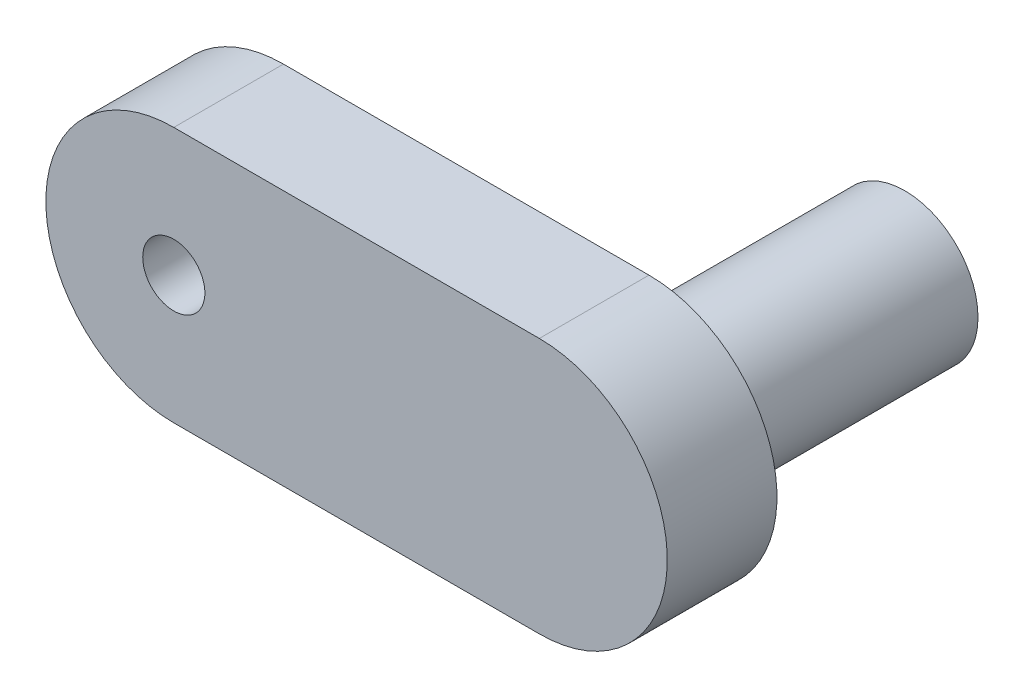
ISO-10303-21;
HEADER;
FILE_DESCRIPTION(('STEP AP214'),'2;1');
FILE_NAME('part.step','',(''),(''),'','','');
FILE_SCHEMA(('AUTOMOTIVE_DESIGN { 1 0 10303 214 1 1 1 1 }'));
ENDSEC;
DATA;
#1=APPLICATION_CONTEXT('core data for automotive mechanical design processes');
#2=APPLICATION_PROTOCOL_DEFINITION('international standard','automotive_design',2000,#1);
#3=PRODUCT_CONTEXT('',#1,'mechanical');
#4=PRODUCT('Part','Part','',(#3));
#5=PRODUCT_RELATED_PRODUCT_CATEGORY('part','',(#4));
#6=PRODUCT_DEFINITION_FORMATION('','',#4);
#7=PRODUCT_DEFINITION_CONTEXT('part definition',#1,'design');
#8=PRODUCT_DEFINITION('design','',#6,#7);
#9=PRODUCT_DEFINITION_SHAPE('','',#8);
#10=(LENGTH_UNIT() NAMED_UNIT(*) SI_UNIT(.MILLI.,.METRE.));
#11=(NAMED_UNIT(*) PLANE_ANGLE_UNIT() SI_UNIT($,.RADIAN.));
#12=(NAMED_UNIT(*) SI_UNIT($,.STERADIAN.) SOLID_ANGLE_UNIT());
#13=UNCERTAINTY_MEASURE_WITH_UNIT(LENGTH_MEASURE(1.E-05),#10,'distance_accuracy_value','');
#14=(GEOMETRIC_REPRESENTATION_CONTEXT(3) GLOBAL_UNCERTAINTY_ASSIGNED_CONTEXT((#13)) GLOBAL_UNIT_ASSIGNED_CONTEXT((#10,
#11,#12)) REPRESENTATION_CONTEXT('',''));
#15=CARTESIAN_POINT('',(0.,0.,0.));
#16=DIRECTION('',(0.,0.,1.));
#17=DIRECTION('',(1.,0.,0.));
#18=AXIS2_PLACEMENT_3D('',#15,#16,#17);
#19=CARTESIAN_POINT('',(0.,0.,1.5));
#20=DIRECTION('',(0.,0.,-1.));
#21=DIRECTION('',(-1.,0.,0.));
#22=AXIS2_PLACEMENT_3D('',#19,#20,#21);
#23=CYLINDRICAL_SURFACE('',#22,3.5);
#24=CARTESIAN_POINT('',(0.,0.,-1.5));
#25=DIRECTION('',(0.,0.,1.));
#26=DIRECTION('',(1.,0.,0.));
#27=AXIS2_PLACEMENT_3D('',#24,#25,#26);
#28=CIRCLE('',#27,3.5);
#29=CARTESIAN_POINT('',(0.,3.5,-1.5));
#30=VERTEX_POINT('',#29);
#31=CARTESIAN_POINT('',(0.,-3.5,-1.5));
#32=VERTEX_POINT('',#31);
#33=EDGE_CURVE('E98',#30,#32,#28,.T.);
#34=ORIENTED_EDGE('',*,*,#33,.T.);
#35=DIRECTION('',(0.,0.,-1.));
#36=VECTOR('',#35,1.);
#37=CARTESIAN_POINT('',(0.,-3.5,1.5));
#38=LINE('',#37,#36);
#39=CARTESIAN_POINT('',(0.,-3.5,1.5));
#40=VERTEX_POINT('',#39);
#41=EDGE_CURVE('E40',#40,#32,#38,.T.);
#42=ORIENTED_EDGE('',*,*,#41,.F.);
#43=CARTESIAN_POINT('',(0.,0.,1.5));
#44=DIRECTION('',(0.,0.,1.));
#45=DIRECTION('',(1.,0.,0.));
#46=AXIS2_PLACEMENT_3D('',#43,#44,#45);
#47=CIRCLE('',#46,3.5);
#48=CARTESIAN_POINT('',(0.,3.5,1.5));
#49=VERTEX_POINT('',#48);
#50=EDGE_CURVE('E84',#49,#40,#47,.T.);
#51=ORIENTED_EDGE('',*,*,#50,.F.);
#52=DIRECTION('',(0.,0.,-1.));
#53=VECTOR('',#52,1.);
#54=CARTESIAN_POINT('',(0.,3.5,1.5));
#55=LINE('',#54,#53);
#56=EDGE_CURVE('E94',#49,#30,#55,.T.);
#57=ORIENTED_EDGE('',*,*,#56,.T.);
#58=EDGE_LOOP('',(#34,#42,#51,#57));
#59=FACE_BOUND('',#58,.T.);
#60=ADVANCED_FACE('F32',(#59),#23,.T.);
#61=CARTESIAN_POINT('',(0.,-3.5,1.5));
#62=DIRECTION('',(0.,1.,0.));
#63=DIRECTION('',(0.,0.,1.));
#64=AXIS2_PLACEMENT_3D('',#61,#62,#63);
#65=PLANE('',#64);
#66=DIRECTION('',(1.,0.,0.));
#67=VECTOR('',#66,1.);
#68=CARTESIAN_POINT('',(0.,-3.5,-1.5));
#69=LINE('',#68,#67);
#70=CARTESIAN_POINT('',(10.,-3.5,-1.5));
#71=VERTEX_POINT('',#70);
#72=EDGE_CURVE('E89',#32,#71,#69,.T.);
#73=ORIENTED_EDGE('',*,*,#72,.T.);
#74=DIRECTION('',(0.,0.,-1.));
#75=VECTOR('',#74,1.);
#76=CARTESIAN_POINT('',(10.,-3.5,1.5));
#77=LINE('',#76,#75);
#78=CARTESIAN_POINT('',(10.,-3.5,1.5));
#79=VERTEX_POINT('',#78);
#80=EDGE_CURVE('E87',#79,#71,#77,.T.);
#81=ORIENTED_EDGE('',*,*,#80,.F.);
#82=DIRECTION('',(1.,0.,0.));
#83=VECTOR('',#82,1.);
#84=CARTESIAN_POINT('',(0.,-3.5,1.5));
#85=LINE('',#84,#83);
#86=EDGE_CURVE('E79',#40,#79,#85,.T.);
#87=ORIENTED_EDGE('',*,*,#86,.F.);
#88=ORIENTED_EDGE('',*,*,#41,.T.);
#89=EDGE_LOOP('',(#73,#81,#87,#88));
#90=FACE_BOUND('',#89,.T.);
#91=ADVANCED_FACE('F88',(#90),#65,.F.);
#92=CARTESIAN_POINT('',(10.,0.,1.5));
#93=DIRECTION('',(0.,0.,-1.));
#94=DIRECTION('',(-1.,0.,0.));
#95=AXIS2_PLACEMENT_3D('',#92,#93,#94);
#96=CYLINDRICAL_SURFACE('',#95,3.5);
#97=CARTESIAN_POINT('',(10.,0.,-1.5));
#98=DIRECTION('',(0.,0.,1.));
#99=DIRECTION('',(1.,0.,0.));
#100=AXIS2_PLACEMENT_3D('',#97,#98,#99);
#101=CIRCLE('',#100,3.5);
#102=CARTESIAN_POINT('',(10.,3.5,-1.5));
#103=VERTEX_POINT('',#102);
#104=EDGE_CURVE('E65',#71,#103,#101,.T.);
#105=ORIENTED_EDGE('',*,*,#104,.T.);
#106=DIRECTION('',(0.,0.,-1.));
#107=VECTOR('',#106,1.);
#108=CARTESIAN_POINT('',(10.,3.5,1.5));
#109=LINE('',#108,#107);
#110=CARTESIAN_POINT('',(10.,3.5,1.5));
#111=VERTEX_POINT('',#110);
#112=EDGE_CURVE('E90',#111,#103,#109,.T.);
#113=ORIENTED_EDGE('',*,*,#112,.F.);
#114=CARTESIAN_POINT('',(10.,0.,1.5));
#115=DIRECTION('',(0.,0.,1.));
#116=DIRECTION('',(1.,0.,0.));
#117=AXIS2_PLACEMENT_3D('',#114,#115,#116);
#118=CIRCLE('',#117,3.5);
#119=EDGE_CURVE('E82',#79,#111,#118,.T.);
#120=ORIENTED_EDGE('',*,*,#119,.F.);
#121=ORIENTED_EDGE('',*,*,#80,.T.);
#122=EDGE_LOOP('',(#105,#113,#120,#121));
#123=FACE_BOUND('',#122,.T.);
#124=ADVANCED_FACE('F92',(#123),#96,.T.);
#125=CARTESIAN_POINT('',(0.,3.5,1.5));
#126=DIRECTION('',(0.,-1.,0.));
#127=DIRECTION('',(0.,0.,-1.));
#128=AXIS2_PLACEMENT_3D('',#125,#126,#127);
#129=PLANE('',#128);
#130=DIRECTION('',(-1.,0.,0.));
#131=VECTOR('',#130,1.);
#132=CARTESIAN_POINT('',(0.,3.5,-1.5));
#133=LINE('',#132,#131);
#134=EDGE_CURVE('E71',#103,#30,#133,.T.);
#135=ORIENTED_EDGE('',*,*,#134,.T.);
#136=ORIENTED_EDGE('',*,*,#56,.F.);
#137=DIRECTION('',(-1.,0.,0.));
#138=VECTOR('',#137,1.);
#139=CARTESIAN_POINT('',(0.,3.5,1.5));
#140=LINE('',#139,#138);
#141=EDGE_CURVE('E48',#111,#49,#140,.T.);
#142=ORIENTED_EDGE('',*,*,#141,.F.);
#143=ORIENTED_EDGE('',*,*,#112,.T.);
#144=EDGE_LOOP('',(#135,#136,#142,#143));
#145=FACE_BOUND('',#144,.T.);
#146=ADVANCED_FACE('F121',(#145),#129,.F.);
#147=CARTESIAN_POINT('',(0.,0.,1.5));
#148=DIRECTION('',(0.,0.,1.));
#149=DIRECTION('',(1.,0.,0.));
#150=AXIS2_PLACEMENT_3D('',#147,#148,#149);
#151=PLANE('',#150);
#152=CARTESIAN_POINT('',(0.,0.,1.5));
#153=DIRECTION('',(0.,0.,1.));
#154=DIRECTION('',(1.,0.,0.));
#155=AXIS2_PLACEMENT_3D('',#152,#153,#154);
#156=CIRCLE('',#155,0.85);
#157=CARTESIAN_POINT('',(-0.85,0.,1.5));
#158=VERTEX_POINT('',#157);
#159=EDGE_CURVE('E182',#158,#158,#156,.F.);
#160=ORIENTED_EDGE('',*,*,#159,.T.);
#161=EDGE_LOOP('',(#160));
#162=FACE_BOUND('',#161,.T.);
#163=ORIENTED_EDGE('',*,*,#50,.T.);
#164=ORIENTED_EDGE('',*,*,#86,.T.);
#165=ORIENTED_EDGE('',*,*,#119,.T.);
#166=ORIENTED_EDGE('',*,*,#141,.T.);
#167=EDGE_LOOP('',(#163,#164,#165,#166));
#168=FACE_BOUND('',#167,.T.);
#169=ADVANCED_FACE('F80',(#162,#168),#151,.T.);
#170=CARTESIAN_POINT('',(0.,0.,-1.5));
#171=DIRECTION('',(0.,0.,1.));
#172=DIRECTION('',(1.,0.,0.));
#173=AXIS2_PLACEMENT_3D('',#170,#171,#172);
#174=PLANE('',#173);
#175=CARTESIAN_POINT('',(0.,0.,-1.5));
#176=DIRECTION('',(0.,0.,-1.));
#177=DIRECTION('',(-1.,0.,0.));
#178=AXIS2_PLACEMENT_3D('',#175,#176,#177);
#179=CIRCLE('',#178,0.85);
#180=CARTESIAN_POINT('',(-0.85,0.,-1.5));
#181=VERTEX_POINT('',#180);
#182=EDGE_CURVE('E179',#181,#181,#179,.T.);
#183=ORIENTED_EDGE('',*,*,#182,.F.);
#184=EDGE_LOOP('',(#183));
#185=FACE_BOUND('',#184,.T.);
#186=CARTESIAN_POINT('',(10.,0.,-1.5));
#187=DIRECTION('',(0.,0.,1.));
#188=DIRECTION('',(1.,0.,0.));
#189=AXIS2_PLACEMENT_3D('',#186,#187,#188);
#190=CIRCLE('',#189,2.);
#191=CARTESIAN_POINT('',(12.,0.,-1.5));
#192=VERTEX_POINT('',#191);
#193=EDGE_CURVE('E11',#192,#192,#190,.F.);
#194=ORIENTED_EDGE('',*,*,#193,.F.);
#195=EDGE_LOOP('',(#194));
#196=FACE_BOUND('',#195,.T.);
#197=ORIENTED_EDGE('',*,*,#33,.F.);
#198=ORIENTED_EDGE('',*,*,#134,.F.);
#199=ORIENTED_EDGE('',*,*,#104,.F.);
#200=ORIENTED_EDGE('',*,*,#72,.F.);
#201=EDGE_LOOP('',(#197,#198,#199,#200));
#202=FACE_BOUND('',#201,.T.);
#203=ADVANCED_FACE('F109',(#185,#196,#202),#174,.F.);
#204=CARTESIAN_POINT('',(10.,0.,-8.5));
#205=DIRECTION('',(0.,0.,1.));
#206=DIRECTION('',(1.,0.,0.));
#207=AXIS2_PLACEMENT_3D('',#204,#205,#206);
#208=CYLINDRICAL_SURFACE('',#207,2.);
#209=CARTESIAN_POINT('',(10.,0.,-8.5));
#210=DIRECTION('',(0.,0.,-1.));
#211=DIRECTION('',(-1.,0.,0.));
#212=AXIS2_PLACEMENT_3D('',#209,#210,#211);
#213=CIRCLE('',#212,2.);
#214=CARTESIAN_POINT('',(8.,0.,-8.5));
#215=VERTEX_POINT('',#214);
#216=EDGE_CURVE('E101',#215,#215,#213,.T.);
#217=ORIENTED_EDGE('',*,*,#216,.F.);
#218=EDGE_LOOP('',(#217));
#219=FACE_BOUND('',#218,.T.);
#220=ORIENTED_EDGE('',*,*,#193,.T.);
#221=EDGE_LOOP('',(#220));
#222=FACE_BOUND('',#221,.T.);
#223=ADVANCED_FACE('F111',(#219,#222),#208,.T.);
#224=CARTESIAN_POINT('',(10.,0.,-8.5));
#225=DIRECTION('',(0.,0.,-1.));
#226=DIRECTION('',(-1.,0.,0.));
#227=AXIS2_PLACEMENT_3D('',#224,#225,#226);
#228=PLANE('',#227);
#229=ORIENTED_EDGE('',*,*,#216,.T.);
#230=EDGE_LOOP('',(#229));
#231=FACE_BOUND('',#230,.T.);
#232=ADVANCED_FACE('F118',(#231),#228,.T.);
#233=CARTESIAN_POINT('',(0.,0.,1.501));
#234=DIRECTION('',(0.,0.,-1.));
#235=DIRECTION('',(-1.,0.,0.));
#236=AXIS2_PLACEMENT_3D('',#233,#234,#235);
#237=CYLINDRICAL_SURFACE('',#236,0.85);
#238=CARTESIAN_POINT('',(-0.85,0.,1.5));
#239=CARTESIAN_POINT('',(-0.85,0.,1.46875));
#240=CARTESIAN_POINT('',(-0.85,0.,1.4375));
#241=CARTESIAN_POINT('',(-0.85,0.,1.375));
#242=CARTESIAN_POINT('',(-0.85,0.,1.34375));
#243=CARTESIAN_POINT('',(-0.85,0.,1.28125));
#244=CARTESIAN_POINT('',(-0.85,0.,1.25));
#245=CARTESIAN_POINT('',(-0.85,0.,1.1875));
#246=CARTESIAN_POINT('',(-0.85,0.,1.15625));
#247=CARTESIAN_POINT('',(-0.85,0.,1.09375));
#248=CARTESIAN_POINT('',(-0.85,0.,1.0625));
#249=CARTESIAN_POINT('',(-0.85,0.,1.));
#250=CARTESIAN_POINT('',(-0.85,0.,0.96875));
#251=CARTESIAN_POINT('',(-0.85,0.,0.90625));
#252=CARTESIAN_POINT('',(-0.85,0.,0.875));
#253=CARTESIAN_POINT('',(-0.85,0.,0.8125));
#254=CARTESIAN_POINT('',(-0.85,0.,0.78125));
#255=CARTESIAN_POINT('',(-0.85,0.,0.71875));
#256=CARTESIAN_POINT('',(-0.85,0.,0.6875));
#257=CARTESIAN_POINT('',(-0.85,0.,0.625));
#258=CARTESIAN_POINT('',(-0.85,0.,0.59375));
#259=CARTESIAN_POINT('',(-0.85,0.,0.53125));
#260=CARTESIAN_POINT('',(-0.85,0.,0.5));
#261=CARTESIAN_POINT('',(-0.85,0.,0.4375));
#262=CARTESIAN_POINT('',(-0.85,0.,0.40625));
#263=CARTESIAN_POINT('',(-0.85,0.,0.34375));
#264=CARTESIAN_POINT('',(-0.85,0.,0.3125));
#265=CARTESIAN_POINT('',(-0.85,0.,0.25));
#266=CARTESIAN_POINT('',(-0.85,0.,0.21875));
#267=CARTESIAN_POINT('',(-0.85,0.,0.15625));
#268=CARTESIAN_POINT('',(-0.85,0.,0.125));
#269=CARTESIAN_POINT('',(-0.85,0.,0.0625000000000001));
#270=CARTESIAN_POINT('',(-0.85,0.,0.03125));
#271=CARTESIAN_POINT('',(-0.85,0.,-0.03125));
#272=CARTESIAN_POINT('',(-0.85,0.,-0.0625000000000001));
#273=CARTESIAN_POINT('',(-0.85,0.,-0.125));
#274=CARTESIAN_POINT('',(-0.85,0.,-0.15625));
#275=CARTESIAN_POINT('',(-0.85,0.,-0.21875));
#276=CARTESIAN_POINT('',(-0.85,0.,-0.25));
#277=CARTESIAN_POINT('',(-0.85,0.,-0.3125));
#278=CARTESIAN_POINT('',(-0.85,0.,-0.34375));
#279=CARTESIAN_POINT('',(-0.85,0.,-0.40625));
#280=CARTESIAN_POINT('',(-0.85,0.,-0.4375));
#281=CARTESIAN_POINT('',(-0.85,0.,-0.5));
#282=CARTESIAN_POINT('',(-0.85,0.,-0.53125));
#283=CARTESIAN_POINT('',(-0.85,0.,-0.59375));
#284=CARTESIAN_POINT('',(-0.85,0.,-0.625));
#285=CARTESIAN_POINT('',(-0.85,0.,-0.6875));
#286=CARTESIAN_POINT('',(-0.85,0.,-0.71875));
#287=CARTESIAN_POINT('',(-0.85,0.,-0.78125));
#288=CARTESIAN_POINT('',(-0.85,0.,-0.8125));
#289=CARTESIAN_POINT('',(-0.85,0.,-0.874999999999999));
#290=CARTESIAN_POINT('',(-0.85,0.,-0.90625));
#291=CARTESIAN_POINT('',(-0.85,0.,-0.96875));
#292=CARTESIAN_POINT('',(-0.85,0.,-1.));
#293=CARTESIAN_POINT('',(-0.85,0.,-1.0625));
#294=CARTESIAN_POINT('',(-0.85,0.,-1.09375));
#295=CARTESIAN_POINT('',(-0.85,0.,-1.15625));
#296=CARTESIAN_POINT('',(-0.85,0.,-1.1875));
#297=CARTESIAN_POINT('',(-0.85,0.,-1.25));
#298=CARTESIAN_POINT('',(-0.85,0.,-1.28125));
#299=CARTESIAN_POINT('',(-0.85,0.,-1.34375));
#300=CARTESIAN_POINT('',(-0.85,0.,-1.375));
#301=CARTESIAN_POINT('',(-0.85,0.,-1.4375));
#302=CARTESIAN_POINT('',(-0.85,0.,-1.46875));
#303=CARTESIAN_POINT('',(-0.85,0.,-1.5));
#304=B_SPLINE_CURVE_WITH_KNOTS('',3,(#238,#239,#240,#241,#242,#243,#244,#245,#246,#247,#248,
#249,#250,#251,#252,#253,#254,#255,#256,#257,#258,#259,#260,#261,#262,#263,#264,#265,#266,#267,
#268,#269,#270,#271,#272,#273,#274,#275,#276,#277,#278,#279,#280,#281,#282,#283,#284,#285,#286,
#287,#288,#289,#290,#291,#292,#293,#294,#295,#296,#297,#298,#299,#300,#301,#302,#303),
.UNSPECIFIED.,.F.,.F.,(4,2,2,2,2,2,2,2,2,2,2,2,2,2,2,2,2,2,2,2,2,2,2,2,2,2,2,2,2,2,2,2,4),(0.,
0.0937499999999999,0.1875,0.28125,0.375,0.46875,0.5625,0.65625,0.75,0.84375,0.9375,1.03125,
1.125,1.21875,1.3125,1.40625,1.5,1.59375,1.6875,1.78125,1.875,1.96875,2.0625,2.15625,2.25,
2.34375,2.4375,2.53125,2.625,2.71875,2.8125,2.90625,3.),.UNSPECIFIED.);
#305=EDGE_CURVE('BSEAM159',#158,#181,#304,.T.);
#306=ORIENTED_EDGE('',*,*,#159,.F.);
#307=ORIENTED_EDGE('',*,*,#182,.T.);
#308=ORIENTED_EDGE('',*,*,#305,.T.);
#309=ORIENTED_EDGE('',*,*,#305,.F.);
#310=EDGE_LOOP('',(#306,#308,#307,#309));
#311=FACE_BOUND('',#310,.T.);
#312=ADVANCED_FACE('F159',(#311),#237,.F.);
#313=CLOSED_SHELL('',(#60,#91,#124,#146,#169,#203,#223,#232,#312));
#314=MANIFOLD_SOLID_BREP('B2',#313);
#315=ADVANCED_BREP_SHAPE_REPRESENTATION('',(#18,#314),#14);
#316=SHAPE_DEFINITION_REPRESENTATION(#9,#315);
ENDSEC;
END-ISO-10303-21;
